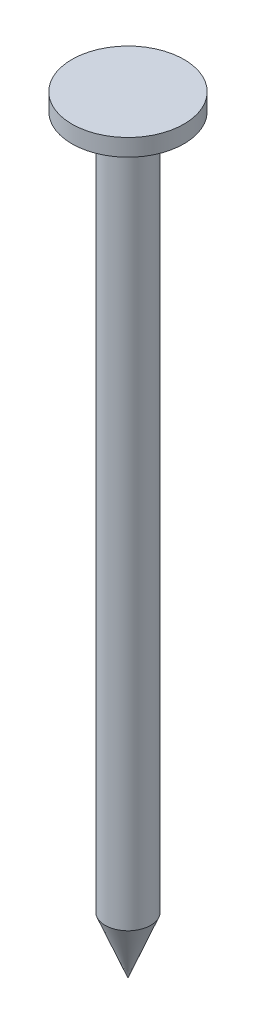
ISO-10303-21;
HEADER;
FILE_DESCRIPTION(('STEP AP214'),'2;1');
FILE_NAME('part.step','',(''),(''),'','','');
FILE_SCHEMA(('AUTOMOTIVE_DESIGN { 1 0 10303 214 1 1 1 1 }'));
ENDSEC;
DATA;
#1=APPLICATION_CONTEXT('core data for automotive mechanical design processes');
#2=APPLICATION_PROTOCOL_DEFINITION('international standard','automotive_design',2000,#1);
#3=PRODUCT_CONTEXT('',#1,'mechanical');
#4=PRODUCT('Part','Part','',(#3));
#5=PRODUCT_RELATED_PRODUCT_CATEGORY('part','',(#4));
#6=PRODUCT_DEFINITION_FORMATION('','',#4);
#7=PRODUCT_DEFINITION_CONTEXT('part definition',#1,'design');
#8=PRODUCT_DEFINITION('design','',#6,#7);
#9=PRODUCT_DEFINITION_SHAPE('','',#8);
#10=(LENGTH_UNIT() NAMED_UNIT(*) SI_UNIT(.MILLI.,.METRE.));
#11=(NAMED_UNIT(*) PLANE_ANGLE_UNIT() SI_UNIT($,.RADIAN.));
#12=(NAMED_UNIT(*) SI_UNIT($,.STERADIAN.) SOLID_ANGLE_UNIT());
#13=UNCERTAINTY_MEASURE_WITH_UNIT(LENGTH_MEASURE(1.E-05),#10,'distance_accuracy_value','');
#14=(GEOMETRIC_REPRESENTATION_CONTEXT(3) GLOBAL_UNCERTAINTY_ASSIGNED_CONTEXT((#13)) GLOBAL_UNIT_ASSIGNED_CONTEXT((#10,
#11,#12)) REPRESENTATION_CONTEXT('',''));
#15=CARTESIAN_POINT('',(0.,0.,0.));
#16=DIRECTION('',(0.,0.,1.));
#17=DIRECTION('',(1.,0.,0.));
#18=AXIS2_PLACEMENT_3D('',#15,#16,#17);
#19=CARTESIAN_POINT('',(0.,18.25,0.));
#20=DIRECTION('',(0.,-1.,0.));
#21=DIRECTION('',(0.,0.,-1.));
#22=AXIS2_PLACEMENT_3D('',#19,#20,#21);
#23=CYLINDRICAL_SURFACE('',#22,0.6);
#24=CARTESIAN_POINT('',(0.,18.25,0.));
#25=DIRECTION('',(0.,1.,0.));
#26=DIRECTION('',(0.,0.,1.));
#27=AXIS2_PLACEMENT_3D('',#24,#25,#26);
#28=CIRCLE('',#27,0.6);
#29=CARTESIAN_POINT('',(0.,18.25,0.6));
#30=VERTEX_POINT('',#29);
#31=EDGE_CURVE('E11',#30,#30,#28,.T.);
#32=ORIENTED_EDGE('',*,*,#31,.F.);
#33=EDGE_LOOP('',(#32));
#34=FACE_BOUND('',#33,.T.);
#35=CARTESIAN_POINT('',(0.,0.,0.));
#36=DIRECTION('',(0.,1.,0.));
#37=DIRECTION('',(0.,0.,1.));
#38=AXIS2_PLACEMENT_3D('',#35,#36,#37);
#39=CIRCLE('',#38,0.6);
#40=CARTESIAN_POINT('',(0.,0.,0.6));
#41=VERTEX_POINT('',#40);
#42=EDGE_CURVE('E78',#41,#41,#39,.T.);
#43=ORIENTED_EDGE('',*,*,#42,.T.);
#44=EDGE_LOOP('',(#43));
#45=FACE_BOUND('',#44,.T.);
#46=ADVANCED_FACE('F45',(#34,#45),#23,.T.);
#47=CARTESIAN_POINT('',(0.,18.7,0.));
#48=DIRECTION('',(0.,-1.,0.));
#49=DIRECTION('',(0.,0.,-1.));
#50=AXIS2_PLACEMENT_3D('',#47,#48,#49);
#51=CYLINDRICAL_SURFACE('',#50,1.475);
#52=CARTESIAN_POINT('',(0.,18.7,0.));
#53=DIRECTION('',(0.,1.,0.));
#54=DIRECTION('',(0.,0.,1.));
#55=AXIS2_PLACEMENT_3D('',#52,#53,#54);
#56=CIRCLE('',#55,1.475);
#57=CARTESIAN_POINT('',(0.,18.7,1.475));
#58=VERTEX_POINT('',#57);
#59=EDGE_CURVE('E52',#58,#58,#56,.T.);
#60=ORIENTED_EDGE('',*,*,#59,.F.);
#61=EDGE_LOOP('',(#60));
#62=FACE_BOUND('',#61,.T.);
#63=CARTESIAN_POINT('',(0.,18.25,0.));
#64=DIRECTION('',(0.,1.,0.));
#65=DIRECTION('',(0.,0.,1.));
#66=AXIS2_PLACEMENT_3D('',#63,#64,#65);
#67=CIRCLE('',#66,1.475);
#68=CARTESIAN_POINT('',(0.,18.25,1.475));
#69=VERTEX_POINT('',#68);
#70=EDGE_CURVE('E80',#69,#69,#67,.T.);
#71=ORIENTED_EDGE('',*,*,#70,.T.);
#72=EDGE_LOOP('',(#71));
#73=FACE_BOUND('',#72,.T.);
#74=ADVANCED_FACE('F69',(#62,#73),#51,.T.);
#75=CARTESIAN_POINT('',(0.,18.7,0.));
#76=DIRECTION('',(0.,1.,0.));
#77=DIRECTION('',(0.,0.,1.));
#78=AXIS2_PLACEMENT_3D('',#75,#76,#77);
#79=PLANE('',#78);
#80=ORIENTED_EDGE('',*,*,#59,.T.);
#81=EDGE_LOOP('',(#80));
#82=FACE_BOUND('',#81,.T.);
#83=ADVANCED_FACE('F63',(#82),#79,.T.);
#84=CARTESIAN_POINT('',(0.,18.25,0.));
#85=DIRECTION('',(0.,1.,0.));
#86=DIRECTION('',(0.,0.,1.));
#87=AXIS2_PLACEMENT_3D('',#84,#85,#86);
#88=PLANE('',#87);
#89=ORIENTED_EDGE('',*,*,#31,.T.);
#90=EDGE_LOOP('',(#89));
#91=FACE_BOUND('',#90,.T.);
#92=ORIENTED_EDGE('',*,*,#70,.F.);
#93=EDGE_LOOP('',(#92));
#94=FACE_BOUND('',#93,.T.);
#95=ADVANCED_FACE('F57',(#91,#94),#88,.F.);
#96=CARTESIAN_POINT('',(0.,-1.5,0.));
#97=DIRECTION('',(0.,1.,0.));
#98=DIRECTION('',(0.,0.,1.));
#99=AXIS2_PLACEMENT_3D('',#96,#97,#98);
#100=CONICAL_SURFACE('',#99,0.,0.380506377112365);
#101=ORIENTED_EDGE('',*,*,#42,.F.);
#102=EDGE_LOOP('',(#101));
#103=FACE_BOUND('',#102,.T.);
#104=CARTESIAN_POINT('',(0.,-1.5,0.));
#105=VERTEX_POINT('',#104);
#106=VERTEX_LOOP('',#105);
#107=FACE_BOUND('',#106,.T.);
#108=ADVANCED_FACE('F55',(#103,#107),#100,.T.);
#109=CLOSED_SHELL('',(#46,#74,#83,#95,#108));
#110=MANIFOLD_SOLID_BREP('B2',#109);
#111=ADVANCED_BREP_SHAPE_REPRESENTATION('',(#18,#110),#14);
#112=SHAPE_DEFINITION_REPRESENTATION(#9,#111);
ENDSEC;
END-ISO-10303-21;
